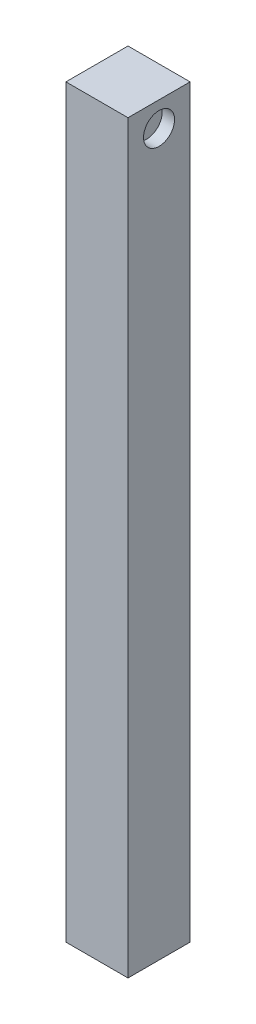
ISO-10303-21;
HEADER;
FILE_DESCRIPTION(('STEP AP214'),'2;1');
FILE_NAME('part.step','',(''),(''),'','','');
FILE_SCHEMA(('AUTOMOTIVE_DESIGN { 1 0 10303 214 1 1 1 1 }'));
ENDSEC;
DATA;
#1=APPLICATION_CONTEXT('core data for automotive mechanical design processes');
#2=APPLICATION_PROTOCOL_DEFINITION('international standard','automotive_design',2000,#1);
#3=PRODUCT_CONTEXT('',#1,'mechanical');
#4=PRODUCT('Part','Part','',(#3));
#5=PRODUCT_RELATED_PRODUCT_CATEGORY('part','',(#4));
#6=PRODUCT_DEFINITION_FORMATION('','',#4);
#7=PRODUCT_DEFINITION_CONTEXT('part definition',#1,'design');
#8=PRODUCT_DEFINITION('design','',#6,#7);
#9=PRODUCT_DEFINITION_SHAPE('','',#8);
#10=(LENGTH_UNIT() NAMED_UNIT(*) SI_UNIT(.MILLI.,.METRE.));
#11=(NAMED_UNIT(*) PLANE_ANGLE_UNIT() SI_UNIT($,.RADIAN.));
#12=(NAMED_UNIT(*) SI_UNIT($,.STERADIAN.) SOLID_ANGLE_UNIT());
#13=UNCERTAINTY_MEASURE_WITH_UNIT(LENGTH_MEASURE(1.E-05),#10,'distance_accuracy_value','');
#14=(GEOMETRIC_REPRESENTATION_CONTEXT(3) GLOBAL_UNCERTAINTY_ASSIGNED_CONTEXT((#13)) GLOBAL_UNIT_ASSIGNED_CONTEXT((#10,
#11,#12)) REPRESENTATION_CONTEXT('',''));
#15=CARTESIAN_POINT('',(0.,0.,0.));
#16=DIRECTION('',(0.,0.,1.));
#17=DIRECTION('',(1.,0.,0.));
#18=AXIS2_PLACEMENT_3D('',#15,#16,#17);
#19=CARTESIAN_POINT('',(50.,-600.,-50.));
#20=DIRECTION('',(0.,0.,1.));
#21=DIRECTION('',(1.,0.,0.));
#22=AXIS2_PLACEMENT_3D('',#19,#20,#21);
#23=PLANE('',#22);
#24=DIRECTION('',(0.,1.,0.));
#25=VECTOR('',#24,1.);
#26=CARTESIAN_POINT('',(-50.,-600.,-50.));
#27=LINE('',#26,#25);
#28=CARTESIAN_POINT('',(-50.,-600.,-50.));
#29=VERTEX_POINT('',#28);
#30=CARTESIAN_POINT('',(-50.,600.,-50.));
#31=VERTEX_POINT('',#30);
#32=EDGE_CURVE('E97',#29,#31,#27,.T.);
#33=ORIENTED_EDGE('',*,*,#32,.T.);
#34=DIRECTION('',(-1.,0.,0.));
#35=VECTOR('',#34,1.);
#36=CARTESIAN_POINT('',(50.,600.,-50.));
#37=LINE('',#36,#35);
#38=CARTESIAN_POINT('',(50.,600.,-50.));
#39=VERTEX_POINT('',#38);
#40=EDGE_CURVE('E11',#39,#31,#37,.T.);
#41=ORIENTED_EDGE('',*,*,#40,.F.);
#42=DIRECTION('',(0.,1.,0.));
#43=VECTOR('',#42,1.);
#44=CARTESIAN_POINT('',(50.,-600.,-50.));
#45=LINE('',#44,#43);
#46=CARTESIAN_POINT('',(50.,-600.,-50.));
#47=VERTEX_POINT('',#46);
#48=EDGE_CURVE('E85',#47,#39,#45,.T.);
#49=ORIENTED_EDGE('',*,*,#48,.F.);
#50=DIRECTION('',(-1.,0.,0.));
#51=VECTOR('',#50,1.);
#52=CARTESIAN_POINT('',(50.,-600.,-50.));
#53=LINE('',#52,#51);
#54=EDGE_CURVE('E93',#47,#29,#53,.T.);
#55=ORIENTED_EDGE('',*,*,#54,.T.);
#56=EDGE_LOOP('',(#33,#41,#49,#55));
#57=FACE_BOUND('',#56,.T.);
#58=ADVANCED_FACE('F34',(#57),#23,.F.);
#59=CARTESIAN_POINT('',(50.,600.,50.));
#60=DIRECTION('',(0.,-1.,0.));
#61=DIRECTION('',(0.,0.,-1.));
#62=AXIS2_PLACEMENT_3D('',#59,#60,#61);
#63=PLANE('',#62);
#64=DIRECTION('',(0.,0.,1.));
#65=VECTOR('',#64,1.);
#66=CARTESIAN_POINT('',(-50.,600.,50.));
#67=LINE('',#66,#65);
#68=CARTESIAN_POINT('',(-50.,600.,50.));
#69=VERTEX_POINT('',#68);
#70=EDGE_CURVE('E89',#31,#69,#67,.T.);
#71=ORIENTED_EDGE('',*,*,#70,.T.);
#72=DIRECTION('',(-1.,0.,0.));
#73=VECTOR('',#72,1.);
#74=CARTESIAN_POINT('',(50.,600.,50.));
#75=LINE('',#74,#73);
#76=CARTESIAN_POINT('',(50.,600.,50.));
#77=VERTEX_POINT('',#76);
#78=EDGE_CURVE('E42',#77,#69,#75,.T.);
#79=ORIENTED_EDGE('',*,*,#78,.F.);
#80=DIRECTION('',(0.,0.,1.));
#81=VECTOR('',#80,1.);
#82=CARTESIAN_POINT('',(50.,600.,50.));
#83=LINE('',#82,#81);
#84=EDGE_CURVE('E80',#39,#77,#83,.T.);
#85=ORIENTED_EDGE('',*,*,#84,.F.);
#86=ORIENTED_EDGE('',*,*,#40,.T.);
#87=EDGE_LOOP('',(#71,#79,#85,#86));
#88=FACE_BOUND('',#87,.T.);
#89=ADVANCED_FACE('F88',(#88),#63,.F.);
#90=CARTESIAN_POINT('',(50.,-600.,50.));
#91=DIRECTION('',(0.,0.,-1.));
#92=DIRECTION('',(-1.,0.,0.));
#93=AXIS2_PLACEMENT_3D('',#90,#91,#92);
#94=PLANE('',#93);
#95=DIRECTION('',(0.,-1.,0.));
#96=VECTOR('',#95,1.);
#97=CARTESIAN_POINT('',(-50.,-600.,50.));
#98=LINE('',#97,#96);
#99=CARTESIAN_POINT('',(-50.,-600.,50.));
#100=VERTEX_POINT('',#99);
#101=EDGE_CURVE('E67',#69,#100,#98,.T.);
#102=ORIENTED_EDGE('',*,*,#101,.T.);
#103=DIRECTION('',(-1.,0.,0.));
#104=VECTOR('',#103,1.);
#105=CARTESIAN_POINT('',(50.,-600.,50.));
#106=LINE('',#105,#104);
#107=CARTESIAN_POINT('',(50.,-600.,50.));
#108=VERTEX_POINT('',#107);
#109=EDGE_CURVE('E90',#108,#100,#106,.T.);
#110=ORIENTED_EDGE('',*,*,#109,.F.);
#111=DIRECTION('',(0.,-1.,0.));
#112=VECTOR('',#111,1.);
#113=CARTESIAN_POINT('',(50.,-600.,50.));
#114=LINE('',#113,#112);
#115=EDGE_CURVE('E83',#77,#108,#114,.T.);
#116=ORIENTED_EDGE('',*,*,#115,.F.);
#117=ORIENTED_EDGE('',*,*,#78,.T.);
#118=EDGE_LOOP('',(#102,#110,#116,#117));
#119=FACE_BOUND('',#118,.T.);
#120=ADVANCED_FACE('F91',(#119),#94,.F.);
#121=CARTESIAN_POINT('',(50.,-600.,50.));
#122=DIRECTION('',(0.,1.,0.));
#123=DIRECTION('',(0.,0.,1.));
#124=AXIS2_PLACEMENT_3D('',#121,#122,#123);
#125=PLANE('',#124);
#126=DIRECTION('',(0.,0.,-1.));
#127=VECTOR('',#126,1.);
#128=CARTESIAN_POINT('',(-50.,-600.,50.));
#129=LINE('',#128,#127);
#130=EDGE_CURVE('E73',#100,#29,#129,.T.);
#131=ORIENTED_EDGE('',*,*,#130,.T.);
#132=ORIENTED_EDGE('',*,*,#54,.F.);
#133=DIRECTION('',(0.,0.,-1.));
#134=VECTOR('',#133,1.);
#135=CARTESIAN_POINT('',(50.,-600.,50.));
#136=LINE('',#135,#134);
#137=EDGE_CURVE('E50',#108,#47,#136,.T.);
#138=ORIENTED_EDGE('',*,*,#137,.F.);
#139=ORIENTED_EDGE('',*,*,#109,.T.);
#140=EDGE_LOOP('',(#131,#132,#138,#139));
#141=FACE_BOUND('',#140,.T.);
#142=ADVANCED_FACE('F105',(#141),#125,.F.);
#143=CARTESIAN_POINT('',(50.,0.,0.));
#144=DIRECTION('',(-1.,0.,0.));
#145=DIRECTION('',(0.,0.,1.));
#146=AXIS2_PLACEMENT_3D('',#143,#144,#145);
#147=PLANE('',#146);
#148=CARTESIAN_POINT('',(50.,560.,0.));
#149=DIRECTION('',(1.,0.,0.));
#150=DIRECTION('',(0.,0.,-1.));
#151=AXIS2_PLACEMENT_3D('',#148,#149,#150);
#152=CIRCLE('',#151,25.);
#153=CARTESIAN_POINT('',(50.,560.,-25.));
#154=VERTEX_POINT('',#153);
#155=EDGE_CURVE('E111',#154,#154,#152,.T.);
#156=ORIENTED_EDGE('',*,*,#155,.F.);
#157=EDGE_LOOP('',(#156));
#158=FACE_BOUND('',#157,.T.);
#159=ORIENTED_EDGE('',*,*,#48,.T.);
#160=ORIENTED_EDGE('',*,*,#84,.T.);
#161=ORIENTED_EDGE('',*,*,#115,.T.);
#162=ORIENTED_EDGE('',*,*,#137,.T.);
#163=EDGE_LOOP('',(#159,#160,#161,#162));
#164=FACE_BOUND('',#163,.T.);
#165=ADVANCED_FACE('F81',(#158,#164),#147,.F.);
#166=CARTESIAN_POINT('',(-50.,0.,0.));
#167=DIRECTION('',(-1.,0.,0.));
#168=DIRECTION('',(0.,0.,1.));
#169=AXIS2_PLACEMENT_3D('',#166,#167,#168);
#170=PLANE('',#169);
#171=ORIENTED_EDGE('',*,*,#32,.F.);
#172=ORIENTED_EDGE('',*,*,#130,.F.);
#173=ORIENTED_EDGE('',*,*,#101,.F.);
#174=ORIENTED_EDGE('',*,*,#70,.F.);
#175=EDGE_LOOP('',(#171,#172,#173,#174));
#176=FACE_BOUND('',#175,.T.);
#177=ADVANCED_FACE('F108',(#176),#170,.T.);
#178=CARTESIAN_POINT('',(30.,560.,0.));
#179=DIRECTION('',(1.,0.,0.));
#180=DIRECTION('',(0.,0.,-1.));
#181=AXIS2_PLACEMENT_3D('',#178,#179,#180);
#182=CYLINDRICAL_SURFACE('',#181,25.);
#183=CARTESIAN_POINT('',(30.,560.,0.));
#184=DIRECTION('',(1.,0.,0.));
#185=DIRECTION('',(0.,0.,-1.));
#186=AXIS2_PLACEMENT_3D('',#183,#184,#185);
#187=CIRCLE('',#186,25.);
#188=CARTESIAN_POINT('',(30.,560.,-25.));
#189=VERTEX_POINT('',#188);
#190=EDGE_CURVE('E100',#189,#189,#187,.T.);
#191=ORIENTED_EDGE('',*,*,#190,.F.);
#192=EDGE_LOOP('',(#191));
#193=FACE_BOUND('',#192,.T.);
#194=ORIENTED_EDGE('',*,*,#155,.T.);
#195=EDGE_LOOP('',(#194));
#196=FACE_BOUND('',#195,.T.);
#197=ADVANCED_FACE('F119',(#193,#196),#182,.F.);
#198=CARTESIAN_POINT('',(30.,560.,0.));
#199=DIRECTION('',(1.,0.,0.));
#200=DIRECTION('',(0.,0.,-1.));
#201=AXIS2_PLACEMENT_3D('',#198,#199,#200);
#202=PLANE('',#201);
#203=ORIENTED_EDGE('',*,*,#190,.T.);
#204=EDGE_LOOP('',(#203));
#205=FACE_BOUND('',#204,.T.);
#206=ADVANCED_FACE('F117',(#205),#202,.T.);
#207=CLOSED_SHELL('',(#58,#89,#120,#142,#165,#177,#197,#206));
#208=MANIFOLD_SOLID_BREP('B2',#207);
#209=ADVANCED_BREP_SHAPE_REPRESENTATION('',(#18,#208),#14);
#210=SHAPE_DEFINITION_REPRESENTATION(#9,#209);
ENDSEC;
END-ISO-10303-21;
